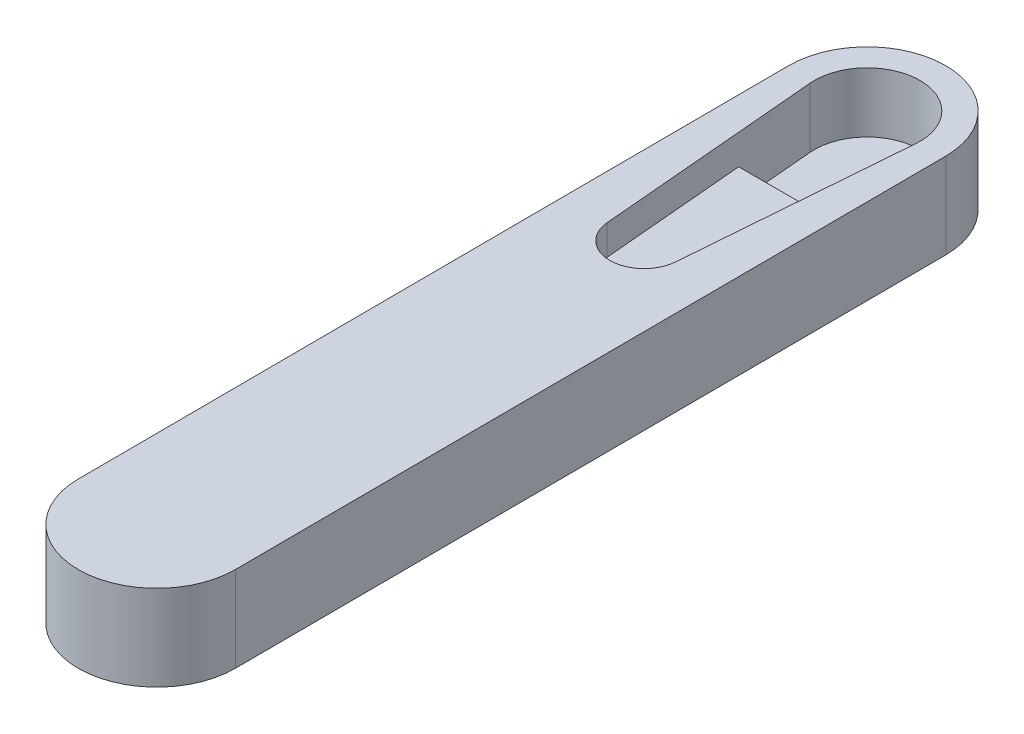
ISO-10303-21;
HEADER;
FILE_DESCRIPTION(('STEP AP214'),'2;1');
FILE_NAME('part.step','',(''),(''),'','','');
FILE_SCHEMA(('AUTOMOTIVE_DESIGN { 1 0 10303 214 1 1 1 1 }'));
ENDSEC;
DATA;
#1=APPLICATION_CONTEXT('core data for automotive mechanical design processes');
#2=APPLICATION_PROTOCOL_DEFINITION('international standard','automotive_design',2000,#1);
#3=PRODUCT_CONTEXT('',#1,'mechanical');
#4=PRODUCT('Part','Part','',(#3));
#5=PRODUCT_RELATED_PRODUCT_CATEGORY('part','',(#4));
#6=PRODUCT_DEFINITION_FORMATION('','',#4);
#7=PRODUCT_DEFINITION_CONTEXT('part definition',#1,'design');
#8=PRODUCT_DEFINITION('design','',#6,#7);
#9=PRODUCT_DEFINITION_SHAPE('','',#8);
#10=(LENGTH_UNIT() NAMED_UNIT(*) SI_UNIT(.MILLI.,.METRE.));
#11=(NAMED_UNIT(*) PLANE_ANGLE_UNIT() SI_UNIT($,.RADIAN.));
#12=(NAMED_UNIT(*) SI_UNIT($,.STERADIAN.) SOLID_ANGLE_UNIT());
#13=UNCERTAINTY_MEASURE_WITH_UNIT(LENGTH_MEASURE(1.E-05),#10,'distance_accuracy_value','');
#14=(GEOMETRIC_REPRESENTATION_CONTEXT(3) GLOBAL_UNCERTAINTY_ASSIGNED_CONTEXT((#13)) GLOBAL_UNIT_ASSIGNED_CONTEXT((#10,
#11,#12)) REPRESENTATION_CONTEXT('',''));
#15=CARTESIAN_POINT('',(0.,0.,0.));
#16=DIRECTION('',(0.,0.,1.));
#17=DIRECTION('',(1.,0.,0.));
#18=AXIS2_PLACEMENT_3D('',#15,#16,#17);
#19=CARTESIAN_POINT('',(-0.196386129317822,3.9,-30.0319644524511));
#20=DIRECTION('',(0.,-1.,0.));
#21=DIRECTION('',(0.,0.,-1.));
#22=AXIS2_PLACEMENT_3D('',#19,#20,#21);
#23=PLANE('',#22);
#24=DIRECTION('',(1.,0.,0.));
#25=VECTOR('',#24,1.);
#26=CARTESIAN_POINT('',(-3.40552000762039,3.9,-24.2319644524511));
#27=LINE('',#26,#25);
#28=CARTESIAN_POINT('',(-3.40552000762039,3.9,-24.2319644524511));
#29=VERTEX_POINT('',#28);
#30=CARTESIAN_POINT('',(3.05620997712213,3.9,-24.2319644524511));
#31=VERTEX_POINT('',#30);
#32=EDGE_CURVE('E145',#29,#31,#27,.T.);
#33=ORIENTED_EDGE('',*,*,#32,.F.);
#34=DIRECTION('',(0.0867163433258175,0.,0.996233042917268));
#35=VECTOR('',#34,1.);
#36=CARTESIAN_POINT('',(-3.88244838811171,3.9,-29.7111139821456));
#37=LINE('',#36,#35);
#38=CARTESIAN_POINT('',(-2.52566687793856,3.9,-14.1238495679269));
#39=VERTEX_POINT('',#38);
#40=EDGE_CURVE('E159',#29,#39,#37,.T.);
#41=ORIENTED_EDGE('',*,*,#40,.T.);
#42=CARTESIAN_POINT('',(-0.134707574937115,3.9,-14.3319687919088));
#43=DIRECTION('',(0.,1.,0.));
#44=DIRECTION('',(0.,0.,1.));
#45=AXIS2_PLACEMENT_3D('',#42,#43,#44);
#46=CIRCLE('',#45,2.4);
#47=CARTESIAN_POINT('',(2.25781312387008,3.9,-14.1426418107911));
#48=VERTEX_POINT('',#47);
#49=EDGE_CURVE('E162',#39,#48,#46,.T.);
#50=ORIENTED_EDGE('',*,*,#49,.T.);
#51=DIRECTION('',(0.0788862421323801,0.,-0.996883624502997));
#52=VECTOR('',#51,1.);
#53=CARTESIAN_POINT('',(3.49208328134327,3.9,-29.7400853565613));
#54=LINE('',#53,#52);
#55=EDGE_CURVE('E130',#48,#31,#54,.T.);
#56=ORIENTED_EDGE('',*,*,#55,.T.);
#57=EDGE_LOOP('',(#33,#41,#50,#56));
#58=FACE_BOUND('',#57,.T.);
#59=ADVANCED_FACE('F42',(#58),#23,.F.);
#60=CARTESIAN_POINT('',(-0.196386129317822,6.,-30.0319644524511));
#61=DIRECTION('',(0.,-1.,0.));
#62=DIRECTION('',(0.,0.,-1.));
#63=AXIS2_PLACEMENT_3D('',#60,#61,#62);
#64=CYLINDRICAL_SURFACE('',#63,5.5);
#65=CARTESIAN_POINT('',(-0.196386129317822,0.,-30.0319644524511));
#66=DIRECTION('',(0.,1.,0.));
#67=DIRECTION('',(0.,0.,-1.));
#68=AXIS2_PLACEMENT_3D('',#65,#66,#67);
#69=CIRCLE('',#68,5.5);
#70=CARTESIAN_POINT('',(5.30357142857142,0.,-30.0535714285714));
#71=VERTEX_POINT('',#70);
#72=CARTESIAN_POINT('',(-5.69634368720706,0.,-30.0103574763308));
#73=VERTEX_POINT('',#72);
#74=EDGE_CURVE('E185',#71,#73,#69,.T.);
#75=ORIENTED_EDGE('',*,*,#74,.T.);
#76=DIRECTION('',(0.,-1.,0.));
#77=VECTOR('',#76,1.);
#78=CARTESIAN_POINT('',(-5.69634368720706,6.,-30.0103574763308));
#79=LINE('',#78,#77);
#80=CARTESIAN_POINT('',(-5.69634368720706,6.,-30.0103574763308));
#81=VERTEX_POINT('',#80);
#82=EDGE_CURVE('E11',#81,#73,#79,.T.);
#83=ORIENTED_EDGE('',*,*,#82,.F.);
#84=CARTESIAN_POINT('',(-0.196386129317822,6.,-30.0319644524511));
#85=DIRECTION('',(0.,1.,0.));
#86=DIRECTION('',(0.,0.,-1.));
#87=AXIS2_PLACEMENT_3D('',#84,#85,#86);
#88=CIRCLE('',#87,5.5);
#89=CARTESIAN_POINT('',(5.30357142857142,6.,-30.0535714285714));
#90=VERTEX_POINT('',#89);
#91=EDGE_CURVE('E191',#90,#81,#88,.T.);
#92=ORIENTED_EDGE('',*,*,#91,.F.);
#93=DIRECTION('',(0.,-1.,0.));
#94=VECTOR('',#93,1.);
#95=CARTESIAN_POINT('',(5.30357142857142,6.,-30.0535714285714));
#96=LINE('',#95,#94);
#97=EDGE_CURVE('E205',#90,#71,#96,.T.);
#98=ORIENTED_EDGE('',*,*,#97,.T.);
#99=EDGE_LOOP('',(#75,#83,#92,#98));
#100=FACE_BOUND('',#99,.T.);
#101=ADVANCED_FACE('F44',(#100),#64,.T.);
#102=CARTESIAN_POINT('',(-5.69634368720706,6.,-30.0103574763308));
#103=DIRECTION('',(0.999992283252588,0.,-0.00392854111277828));
#104=DIRECTION('',(-0.00392854111277829,0.,-0.999992283252589));
#105=AXIS2_PLACEMENT_3D('',#102,#103,#104);
#106=PLANE('',#105);
#107=DIRECTION('',(0.00392854111277828,0.,0.999992283252588));
#108=VECTOR('',#107,1.);
#109=CARTESIAN_POINT('',(-5.69634368720706,0.,-30.0103574763308));
#110=LINE('',#109,#108);
#111=CARTESIAN_POINT('',(-5.49991511577848,0.,19.9896425236692));
#112=VERTEX_POINT('',#111);
#113=EDGE_CURVE('E209',#73,#112,#110,.T.);
#114=ORIENTED_EDGE('',*,*,#113,.T.);
#115=DIRECTION('',(0.,-1.,0.));
#116=VECTOR('',#115,1.);
#117=CARTESIAN_POINT('',(-5.49991511577848,6.,19.9896425236692));
#118=LINE('',#117,#116);
#119=CARTESIAN_POINT('',(-5.49991511577848,6.,19.9896425236692));
#120=VERTEX_POINT('',#119);
#121=EDGE_CURVE('E51',#120,#112,#118,.T.);
#122=ORIENTED_EDGE('',*,*,#121,.F.);
#123=DIRECTION('',(0.00392854111277828,0.,0.999992283252588));
#124=VECTOR('',#123,1.);
#125=CARTESIAN_POINT('',(-5.69634368720706,6.,-30.0103574763308));
#126=LINE('',#125,#124);
#127=EDGE_CURVE('E195',#81,#120,#126,.T.);
#128=ORIENTED_EDGE('',*,*,#127,.F.);
#129=ORIENTED_EDGE('',*,*,#82,.T.);
#130=EDGE_LOOP('',(#114,#122,#128,#129));
#131=FACE_BOUND('',#130,.T.);
#132=ADVANCED_FACE('F245',(#131),#106,.F.);
#133=CARTESIAN_POINT('',(4.2442110762507E-05,6.,19.9680355475489));
#134=DIRECTION('',(0.,-1.,0.));
#135=DIRECTION('',(0.,0.,-1.));
#136=AXIS2_PLACEMENT_3D('',#133,#134,#135);
#137=CYLINDRICAL_SURFACE('',#136,5.5);
#138=CARTESIAN_POINT('',(4.2442110762507E-05,0.,19.9680355475489));
#139=DIRECTION('',(0.,1.,0.));
#140=DIRECTION('',(0.,0.,1.));
#141=AXIS2_PLACEMENT_3D('',#138,#139,#140);
#142=CIRCLE('',#141,5.5);
#143=CARTESIAN_POINT('',(5.5,0.,19.9464285714286));
#144=VERTEX_POINT('',#143);
#145=EDGE_CURVE('E212',#112,#144,#142,.T.);
#146=ORIENTED_EDGE('',*,*,#145,.T.);
#147=DIRECTION('',(0.,-1.,0.));
#148=VECTOR('',#147,1.);
#149=CARTESIAN_POINT('',(5.5,6.,19.9464285714286));
#150=LINE('',#149,#148);
#151=CARTESIAN_POINT('',(5.5,6.,19.9464285714286));
#152=VERTEX_POINT('',#151);
#153=EDGE_CURVE('E220',#152,#144,#150,.T.);
#154=ORIENTED_EDGE('',*,*,#153,.F.);
#155=CARTESIAN_POINT('',(4.2442110762507E-05,6.,19.9680355475489));
#156=DIRECTION('',(0.,1.,0.));
#157=DIRECTION('',(0.,0.,1.));
#158=AXIS2_PLACEMENT_3D('',#155,#156,#157);
#159=CIRCLE('',#158,5.5);
#160=EDGE_CURVE('E199',#120,#152,#159,.T.);
#161=ORIENTED_EDGE('',*,*,#160,.F.);
#162=ORIENTED_EDGE('',*,*,#121,.T.);
#163=EDGE_LOOP('',(#146,#154,#161,#162));
#164=FACE_BOUND('',#163,.T.);
#165=ADVANCED_FACE('F229',(#164),#137,.T.);
#166=CARTESIAN_POINT('',(5.30357142857142,6.,-30.0535714285714));
#167=DIRECTION('',(-0.999992283252588,0.,0.00392854111277828));
#168=DIRECTION('',(0.00392854111277829,0.,0.999992283252589));
#169=AXIS2_PLACEMENT_3D('',#166,#167,#168);
#170=PLANE('',#169);
#171=DIRECTION('',(-0.00392854111277828,0.,-0.999992283252588));
#172=VECTOR('',#171,1.);
#173=CARTESIAN_POINT('',(5.30357142857142,0.,-30.0535714285714));
#174=LINE('',#173,#172);
#175=EDGE_CURVE('E196',#144,#71,#174,.T.);
#176=ORIENTED_EDGE('',*,*,#175,.T.);
#177=ORIENTED_EDGE('',*,*,#97,.F.);
#178=DIRECTION('',(-0.00392854111277828,0.,-0.999992283252588));
#179=VECTOR('',#178,1.);
#180=CARTESIAN_POINT('',(5.30357142857142,6.,-30.0535714285714));
#181=LINE('',#180,#179);
#182=EDGE_CURVE('E202',#152,#90,#181,.T.);
#183=ORIENTED_EDGE('',*,*,#182,.F.);
#184=ORIENTED_EDGE('',*,*,#153,.T.);
#185=EDGE_LOOP('',(#176,#177,#183,#184));
#186=FACE_BOUND('',#185,.T.);
#187=ADVANCED_FACE('F238',(#186),#170,.F.);
#188=CARTESIAN_POINT('',(-0.196386129317822,6.,-30.0319644524511));
#189=DIRECTION('',(0.,-1.,0.));
#190=DIRECTION('',(0.,0.,-1.));
#191=AXIS2_PLACEMENT_3D('',#188,#189,#190);
#192=PLANE('',#191);
#193=DIRECTION('',(0.0867163433258175,0.,0.996233042917268));
#194=VECTOR('',#193,1.);
#195=CARTESIAN_POINT('',(-3.88244838811171,6.,-29.7111139821456));
#196=LINE('',#195,#194);
#197=CARTESIAN_POINT('',(-3.88244838811171,6.,-29.7111139821456));
#198=VERTEX_POINT('',#197);
#199=CARTESIAN_POINT('',(-2.52566687793856,6.,-14.1238495679269));
#200=VERTEX_POINT('',#199);
#201=EDGE_CURVE('E172',#198,#200,#196,.T.);
#202=ORIENTED_EDGE('',*,*,#201,.F.);
#203=CARTESIAN_POINT('',(-0.196386129317822,6.,-30.0319644524511));
#204=DIRECTION('',(0.,1.,0.));
#205=DIRECTION('',(0.,0.,-1.));
#206=AXIS2_PLACEMENT_3D('',#203,#204,#205);
#207=CIRCLE('',#206,3.7);
#208=CARTESIAN_POINT('',(3.49208328134327,6.,-29.7400853565613));
#209=VERTEX_POINT('',#208);
#210=EDGE_CURVE('E66',#209,#198,#207,.T.);
#211=ORIENTED_EDGE('',*,*,#210,.F.);
#212=DIRECTION('',(0.0788862421323801,0.,-0.996883624502997));
#213=VECTOR('',#212,1.);
#214=CARTESIAN_POINT('',(3.49208328134327,6.,-29.7400853565613));
#215=LINE('',#214,#213);
#216=CARTESIAN_POINT('',(2.25781312387008,6.,-14.1426418107911));
#217=VERTEX_POINT('',#216);
#218=EDGE_CURVE('E163',#217,#209,#215,.T.);
#219=ORIENTED_EDGE('',*,*,#218,.F.);
#220=CARTESIAN_POINT('',(-0.134707574937115,6.,-14.3319687919088));
#221=DIRECTION('',(0.,1.,0.));
#222=DIRECTION('',(0.,0.,1.));
#223=AXIS2_PLACEMENT_3D('',#220,#221,#222);
#224=CIRCLE('',#223,2.4);
#225=EDGE_CURVE('E175',#200,#217,#224,.T.);
#226=ORIENTED_EDGE('',*,*,#225,.F.);
#227=EDGE_LOOP('',(#202,#211,#219,#226));
#228=FACE_BOUND('',#227,.T.);
#229=ORIENTED_EDGE('',*,*,#91,.T.);
#230=ORIENTED_EDGE('',*,*,#127,.T.);
#231=ORIENTED_EDGE('',*,*,#160,.T.);
#232=ORIENTED_EDGE('',*,*,#182,.T.);
#233=EDGE_LOOP('',(#229,#230,#231,#232));
#234=FACE_BOUND('',#233,.T.);
#235=ADVANCED_FACE('F244',(#228,#234),#192,.F.);
#236=CARTESIAN_POINT('',(-0.196386129317822,0.,-30.0319644524511));
#237=DIRECTION('',(0.,-1.,0.));
#238=DIRECTION('',(0.,0.,-1.));
#239=AXIS2_PLACEMENT_3D('',#236,#237,#238);
#240=PLANE('',#239);
#241=ORIENTED_EDGE('',*,*,#74,.F.);
#242=ORIENTED_EDGE('',*,*,#175,.F.);
#243=ORIENTED_EDGE('',*,*,#145,.F.);
#244=ORIENTED_EDGE('',*,*,#113,.F.);
#245=EDGE_LOOP('',(#241,#242,#243,#244));
#246=FACE_BOUND('',#245,.T.);
#247=ADVANCED_FACE('F235',(#246),#240,.T.);
#248=CARTESIAN_POINT('',(-0.196386129317822,3.9,-30.0319644524511));
#249=DIRECTION('',(0.,1.,0.));
#250=DIRECTION('',(0.,0.,1.));
#251=AXIS2_PLACEMENT_3D('',#248,#249,#250);
#252=CYLINDRICAL_SURFACE('',#251,3.7);
#253=ORIENTED_EDGE('',*,*,#210,.T.);
#254=DIRECTION('',(0.,1.,0.));
#255=VECTOR('',#254,1.);
#256=CARTESIAN_POINT('',(-3.88244838811171,3.9,-29.7111139821456));
#257=LINE('',#256,#255);
#258=CARTESIAN_POINT('',(-3.88244838811171,1.8,-29.7111139821456));
#259=VERTEX_POINT('',#258);
#260=EDGE_CURVE('E119',#259,#198,#257,.T.);
#261=ORIENTED_EDGE('',*,*,#260,.F.);
#262=CARTESIAN_POINT('',(-0.196386129317822,1.8,-30.0319644524511));
#263=DIRECTION('',(0.,1.,0.));
#264=DIRECTION('',(0.,0.,-1.));
#265=AXIS2_PLACEMENT_3D('',#262,#263,#264);
#266=CIRCLE('',#265,3.7);
#267=CARTESIAN_POINT('',(3.49208328134327,1.8,-29.7400853565613));
#268=VERTEX_POINT('',#267);
#269=EDGE_CURVE('E123',#268,#259,#266,.T.);
#270=ORIENTED_EDGE('',*,*,#269,.F.);
#271=DIRECTION('',(0.,1.,0.));
#272=VECTOR('',#271,1.);
#273=CARTESIAN_POINT('',(3.49208328134327,3.9,-29.7400853565613));
#274=LINE('',#273,#272);
#275=EDGE_CURVE('E182',#268,#209,#274,.T.);
#276=ORIENTED_EDGE('',*,*,#275,.T.);
#277=EDGE_LOOP('',(#253,#261,#270,#276));
#278=FACE_BOUND('',#277,.T.);
#279=ADVANCED_FACE('F121',(#278),#252,.F.);
#280=CARTESIAN_POINT('',(3.49208328134327,3.9,-29.7400853565613));
#281=DIRECTION('',(0.996883624502997,0.,0.0788862421323801));
#282=DIRECTION('',(0.0788862421323801,0.,-0.996883624502997));
#283=AXIS2_PLACEMENT_3D('',#280,#281,#282);
#284=PLANE('',#283);
#285=ORIENTED_EDGE('',*,*,#218,.T.);
#286=ORIENTED_EDGE('',*,*,#275,.F.);
#287=DIRECTION('',(0.07888624213238,0.,-0.996883624502997));
#288=VECTOR('',#287,1.);
#289=CARTESIAN_POINT('',(3.49208328134327,1.8,-29.7400853565613));
#290=LINE('',#289,#288);
#291=CARTESIAN_POINT('',(3.05620997712213,1.8,-24.2319644524511));
#292=VERTEX_POINT('',#291);
#293=EDGE_CURVE('E143',#292,#268,#290,.T.);
#294=ORIENTED_EDGE('',*,*,#293,.F.);
#295=DIRECTION('',(0.,1.,0.));
#296=VECTOR('',#295,1.);
#297=CARTESIAN_POINT('',(3.05620997712213,1.8,-24.2319644524511));
#298=LINE('',#297,#296);
#299=EDGE_CURVE('E154',#292,#31,#298,.T.);
#300=ORIENTED_EDGE('',*,*,#299,.T.);
#301=ORIENTED_EDGE('',*,*,#55,.F.);
#302=DIRECTION('',(0.,1.,0.));
#303=VECTOR('',#302,1.);
#304=CARTESIAN_POINT('',(2.25781312387008,3.9,-14.1426418107911));
#305=LINE('',#304,#303);
#306=EDGE_CURVE('E186',#48,#217,#305,.T.);
#307=ORIENTED_EDGE('',*,*,#306,.T.);
#308=EDGE_LOOP('',(#285,#286,#294,#300,#301,#307));
#309=FACE_BOUND('',#308,.T.);
#310=ADVANCED_FACE('F261',(#309),#284,.F.);
#311=CARTESIAN_POINT('',(-0.134707574937115,3.9,-14.3319687919088));
#312=DIRECTION('',(0.,1.,0.));
#313=DIRECTION('',(0.,0.,1.));
#314=AXIS2_PLACEMENT_3D('',#311,#312,#313);
#315=CYLINDRICAL_SURFACE('',#314,2.4);
#316=ORIENTED_EDGE('',*,*,#225,.T.);
#317=ORIENTED_EDGE('',*,*,#306,.F.);
#318=ORIENTED_EDGE('',*,*,#49,.F.);
#319=DIRECTION('',(0.,1.,0.));
#320=VECTOR('',#319,1.);
#321=CARTESIAN_POINT('',(-2.52566687793856,3.9,-14.1238495679269));
#322=LINE('',#321,#320);
#323=EDGE_CURVE('E129',#39,#200,#322,.T.);
#324=ORIENTED_EDGE('',*,*,#323,.T.);
#325=EDGE_LOOP('',(#316,#317,#318,#324));
#326=FACE_BOUND('',#325,.T.);
#327=ADVANCED_FACE('F264',(#326),#315,.F.);
#328=CARTESIAN_POINT('',(-3.88244838811171,3.9,-29.7111139821456));
#329=DIRECTION('',(-0.996233042917268,0.,0.0867163433258175));
#330=DIRECTION('',(0.0867163433258175,0.,0.996233042917268));
#331=AXIS2_PLACEMENT_3D('',#328,#329,#330);
#332=PLANE('',#331);
#333=ORIENTED_EDGE('',*,*,#201,.T.);
#334=ORIENTED_EDGE('',*,*,#323,.F.);
#335=ORIENTED_EDGE('',*,*,#40,.F.);
#336=DIRECTION('',(0.,1.,0.));
#337=VECTOR('',#336,1.);
#338=CARTESIAN_POINT('',(-3.40552000762039,1.8,-24.2319644524511));
#339=LINE('',#338,#337);
#340=CARTESIAN_POINT('',(-3.40552000762039,1.8,-24.2319644524511));
#341=VERTEX_POINT('',#340);
#342=EDGE_CURVE('E58',#341,#29,#339,.T.);
#343=ORIENTED_EDGE('',*,*,#342,.F.);
#344=DIRECTION('',(0.0867163433258172,0.,0.996233042917268));
#345=VECTOR('',#344,1.);
#346=CARTESIAN_POINT('',(-3.88244838811171,1.8,-29.7111139821456));
#347=LINE('',#346,#345);
#348=EDGE_CURVE('E133',#259,#341,#347,.T.);
#349=ORIENTED_EDGE('',*,*,#348,.F.);
#350=ORIENTED_EDGE('',*,*,#260,.T.);
#351=EDGE_LOOP('',(#333,#334,#335,#343,#349,#350));
#352=FACE_BOUND('',#351,.T.);
#353=ADVANCED_FACE('F134',(#352),#332,.F.);
#354=CARTESIAN_POINT('',(-3.40552000762039,1.8,-24.2319644524511));
#355=DIRECTION('',(0.,0.,1.));
#356=DIRECTION('',(1.,0.,0.));
#357=AXIS2_PLACEMENT_3D('',#354,#355,#356);
#358=PLANE('',#357);
#359=ORIENTED_EDGE('',*,*,#32,.T.);
#360=ORIENTED_EDGE('',*,*,#299,.F.);
#361=DIRECTION('',(1.,0.,0.));
#362=VECTOR('',#361,1.);
#363=CARTESIAN_POINT('',(-3.40552000762039,1.8,-24.2319644524511));
#364=LINE('',#363,#362);
#365=EDGE_CURVE('E139',#341,#292,#364,.T.);
#366=ORIENTED_EDGE('',*,*,#365,.F.);
#367=ORIENTED_EDGE('',*,*,#342,.T.);
#368=EDGE_LOOP('',(#359,#360,#366,#367));
#369=FACE_BOUND('',#368,.T.);
#370=ADVANCED_FACE('F259',(#369),#358,.F.);
#371=CARTESIAN_POINT('',(-0.196386129317822,1.8,-30.0319644524511));
#372=DIRECTION('',(0.,-1.,0.));
#373=DIRECTION('',(0.,0.,-1.));
#374=AXIS2_PLACEMENT_3D('',#371,#372,#373);
#375=PLANE('',#374);
#376=ORIENTED_EDGE('',*,*,#269,.T.);
#377=ORIENTED_EDGE('',*,*,#348,.T.);
#378=ORIENTED_EDGE('',*,*,#365,.T.);
#379=ORIENTED_EDGE('',*,*,#293,.T.);
#380=EDGE_LOOP('',(#376,#377,#378,#379));
#381=FACE_BOUND('',#380,.T.);
#382=ADVANCED_FACE('F141',(#381),#375,.F.);
#383=CLOSED_SHELL('',(#59,#101,#132,#165,#187,#235,#247,#279,#310,#327,#353,#370,#382));
#384=MANIFOLD_SOLID_BREP('B2',#383);
#385=ADVANCED_BREP_SHAPE_REPRESENTATION('',(#18,#384),#14);
#386=SHAPE_DEFINITION_REPRESENTATION(#9,#385);
ENDSEC;
END-ISO-10303-21;
